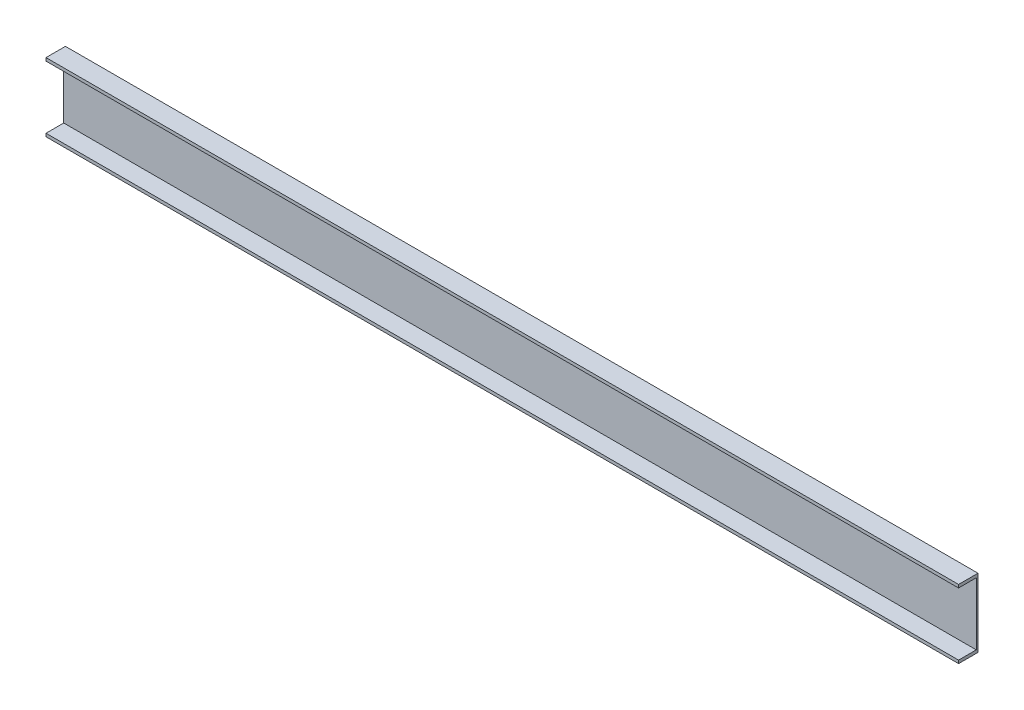
ISO-10303-21;
HEADER;
FILE_DESCRIPTION(('STEP AP214'),'2;1');
FILE_NAME('part.step','',(''),(''),'','','');
FILE_SCHEMA(('AUTOMOTIVE_DESIGN { 1 0 10303 214 1 1 1 1 }'));
ENDSEC;
DATA;
#1=APPLICATION_CONTEXT('core data for automotive mechanical design processes');
#2=APPLICATION_PROTOCOL_DEFINITION('international standard','automotive_design',2000,#1);
#3=PRODUCT_CONTEXT('',#1,'mechanical');
#4=PRODUCT('Part','Part','',(#3));
#5=PRODUCT_RELATED_PRODUCT_CATEGORY('part','',(#4));
#6=PRODUCT_DEFINITION_FORMATION('','',#4);
#7=PRODUCT_DEFINITION_CONTEXT('part definition',#1,'design');
#8=PRODUCT_DEFINITION('design','',#6,#7);
#9=PRODUCT_DEFINITION_SHAPE('','',#8);
#10=(LENGTH_UNIT() NAMED_UNIT(*) SI_UNIT(.MILLI.,.METRE.));
#11=(NAMED_UNIT(*) PLANE_ANGLE_UNIT() SI_UNIT($,.RADIAN.));
#12=(NAMED_UNIT(*) SI_UNIT($,.STERADIAN.) SOLID_ANGLE_UNIT());
#13=UNCERTAINTY_MEASURE_WITH_UNIT(LENGTH_MEASURE(1.E-05),#10,'distance_accuracy_value','');
#14=(GEOMETRIC_REPRESENTATION_CONTEXT(3) GLOBAL_UNCERTAINTY_ASSIGNED_CONTEXT((#13)) GLOBAL_UNIT_ASSIGNED_CONTEXT((#10,
#11,#12)) REPRESENTATION_CONTEXT('',''));
#15=CARTESIAN_POINT('',(0.,0.,0.));
#16=DIRECTION('',(0.,0.,1.));
#17=DIRECTION('',(1.,0.,0.));
#18=AXIS2_PLACEMENT_3D('',#15,#16,#17);
#19=CARTESIAN_POINT('',(-1995.,-150.,7.5));
#20=DIRECTION('',(0.,0.,1.));
#21=DIRECTION('',(1.,0.,0.));
#22=AXIS2_PLACEMENT_3D('',#19,#20,#21);
#23=PLANE('',#22);
#24=DIRECTION('',(0.,-1.,0.));
#25=VECTOR('',#24,1.);
#26=CARTESIAN_POINT('',(-1995.,150.,7.5));
#27=LINE('',#26,#25);
#28=CARTESIAN_POINT('',(-1995.,136.5,7.5));
#29=VERTEX_POINT('',#28);
#30=CARTESIAN_POINT('',(-1995.,-136.5,7.5));
#31=VERTEX_POINT('',#30);
#32=EDGE_CURVE('E55',#29,#31,#27,.T.);
#33=ORIENTED_EDGE('',*,*,#32,.T.);
#34=DIRECTION('',(-1.,0.,0.));
#35=VECTOR('',#34,1.);
#36=CARTESIAN_POINT('',(-1995.,-136.5,7.5));
#37=LINE('',#36,#35);
#38=CARTESIAN_POINT('',(1995.,-136.5,7.5));
#39=VERTEX_POINT('',#38);
#40=EDGE_CURVE('E50',#39,#31,#37,.T.);
#41=ORIENTED_EDGE('',*,*,#40,.F.);
#42=DIRECTION('',(0.,1.,0.));
#43=VECTOR('',#42,1.);
#44=CARTESIAN_POINT('',(1995.,150.,7.5));
#45=LINE('',#44,#43);
#46=CARTESIAN_POINT('',(1995.,136.5,7.5));
#47=VERTEX_POINT('',#46);
#48=EDGE_CURVE('E36',#39,#47,#45,.T.);
#49=ORIENTED_EDGE('',*,*,#48,.T.);
#50=DIRECTION('',(1.,0.,0.));
#51=VECTOR('',#50,1.);
#52=CARTESIAN_POINT('',(-1995.,136.5,7.5));
#53=LINE('',#52,#51);
#54=EDGE_CURVE('E129',#29,#47,#53,.T.);
#55=ORIENTED_EDGE('',*,*,#54,.F.);
#56=EDGE_LOOP('',(#33,#41,#49,#55));
#57=FACE_BOUND('',#56,.T.);
#58=ADVANCED_FACE('F32',(#57),#23,.T.);
#59=CARTESIAN_POINT('',(-1995.,150.,7.5));
#60=DIRECTION('',(1.,0.,0.));
#61=DIRECTION('',(0.,0.,-1.));
#62=AXIS2_PLACEMENT_3D('',#59,#60,#61);
#63=PLANE('',#62);
#64=DIRECTION('',(0.,-1.,0.));
#65=VECTOR('',#64,1.);
#66=CARTESIAN_POINT('',(-1995.,150.,0.));
#67=LINE('',#66,#65);
#68=CARTESIAN_POINT('',(-1995.,150.,0.));
#69=VERTEX_POINT('',#68);
#70=CARTESIAN_POINT('',(-1995.,-150.,0.));
#71=VERTEX_POINT('',#70);
#72=EDGE_CURVE('E155',#69,#71,#67,.T.);
#73=ORIENTED_EDGE('',*,*,#72,.T.);
#74=DIRECTION('',(0.,0.,-1.));
#75=VECTOR('',#74,1.);
#76=CARTESIAN_POINT('',(-1995.,-150.,7.5));
#77=LINE('',#76,#75);
#78=CARTESIAN_POINT('',(-1995.,-150.,85.));
#79=VERTEX_POINT('',#78);
#80=EDGE_CURVE('E11',#79,#71,#77,.T.);
#81=ORIENTED_EDGE('',*,*,#80,.F.);
#82=DIRECTION('',(0.,-1.,0.));
#83=VECTOR('',#82,1.);
#84=CARTESIAN_POINT('',(-1995.,-150.,85.));
#85=LINE('',#84,#83);
#86=CARTESIAN_POINT('',(-1995.,-136.5,85.));
#87=VERTEX_POINT('',#86);
#88=EDGE_CURVE('E119',#87,#79,#85,.T.);
#89=ORIENTED_EDGE('',*,*,#88,.F.);
#90=DIRECTION('',(0.,0.,-1.));
#91=VECTOR('',#90,1.);
#92=CARTESIAN_POINT('',(-1995.,-136.5,85.));
#93=LINE('',#92,#91);
#94=EDGE_CURVE('E124',#87,#31,#93,.T.);
#95=ORIENTED_EDGE('',*,*,#94,.T.);
#96=ORIENTED_EDGE('',*,*,#32,.F.);
#97=DIRECTION('',(0.,0.,-1.));
#98=VECTOR('',#97,1.);
#99=CARTESIAN_POINT('',(-1995.,136.5,85.));
#100=LINE('',#99,#98);
#101=CARTESIAN_POINT('',(-1995.,136.5,85.));
#102=VERTEX_POINT('',#101);
#103=EDGE_CURVE('E151',#102,#29,#100,.T.);
#104=ORIENTED_EDGE('',*,*,#103,.F.);
#105=DIRECTION('',(0.,-1.,0.));
#106=VECTOR('',#105,1.);
#107=CARTESIAN_POINT('',(-1995.,150.,85.));
#108=LINE('',#107,#106);
#109=CARTESIAN_POINT('',(-1995.,150.,85.));
#110=VERTEX_POINT('',#109);
#111=EDGE_CURVE('E130',#110,#102,#108,.T.);
#112=ORIENTED_EDGE('',*,*,#111,.F.);
#113=DIRECTION('',(0.,0.,-1.));
#114=VECTOR('',#113,1.);
#115=CARTESIAN_POINT('',(-1995.,150.,7.5));
#116=LINE('',#115,#114);
#117=EDGE_CURVE('E171',#110,#69,#116,.T.);
#118=ORIENTED_EDGE('',*,*,#117,.T.);
#119=EDGE_LOOP('',(#73,#81,#89,#95,#96,#104,#112,#118));
#120=FACE_BOUND('',#119,.T.);
#121=ADVANCED_FACE('F34',(#120),#63,.F.);
#122=CARTESIAN_POINT('',(-1995.,-150.,7.5));
#123=DIRECTION('',(0.,1.,0.));
#124=DIRECTION('',(-1.,0.,0.));
#125=AXIS2_PLACEMENT_3D('',#122,#123,#124);
#126=PLANE('',#125);
#127=DIRECTION('',(1.,0.,0.));
#128=VECTOR('',#127,1.);
#129=CARTESIAN_POINT('',(-1995.,-150.,0.));
#130=LINE('',#129,#128);
#131=CARTESIAN_POINT('',(1995.,-150.,0.));
#132=VERTEX_POINT('',#131);
#133=EDGE_CURVE('E102',#71,#132,#130,.T.);
#134=ORIENTED_EDGE('',*,*,#133,.T.);
#135=DIRECTION('',(0.,0.,-1.));
#136=VECTOR('',#135,1.);
#137=CARTESIAN_POINT('',(1995.,-150.,7.5));
#138=LINE('',#137,#136);
#139=CARTESIAN_POINT('',(1995.,-150.,85.));
#140=VERTEX_POINT('',#139);
#141=EDGE_CURVE('E42',#140,#132,#138,.T.);
#142=ORIENTED_EDGE('',*,*,#141,.F.);
#143=DIRECTION('',(1.,0.,0.));
#144=VECTOR('',#143,1.);
#145=CARTESIAN_POINT('',(-1995.,-150.,85.));
#146=LINE('',#145,#144);
#147=EDGE_CURVE('E101',#79,#140,#146,.T.);
#148=ORIENTED_EDGE('',*,*,#147,.F.);
#149=ORIENTED_EDGE('',*,*,#80,.T.);
#150=EDGE_LOOP('',(#134,#142,#148,#149));
#151=FACE_BOUND('',#150,.T.);
#152=ADVANCED_FACE('F99',(#151),#126,.F.);
#153=CARTESIAN_POINT('',(1995.,150.,7.5));
#154=DIRECTION('',(-1.,0.,0.));
#155=DIRECTION('',(0.,0.,1.));
#156=AXIS2_PLACEMENT_3D('',#153,#154,#155);
#157=PLANE('',#156);
#158=DIRECTION('',(0.,1.,0.));
#159=VECTOR('',#158,1.);
#160=CARTESIAN_POINT('',(1995.,150.,0.));
#161=LINE('',#160,#159);
#162=CARTESIAN_POINT('',(1995.,150.,0.));
#163=VERTEX_POINT('',#162);
#164=EDGE_CURVE('E164',#132,#163,#161,.T.);
#165=ORIENTED_EDGE('',*,*,#164,.T.);
#166=DIRECTION('',(0.,0.,-1.));
#167=VECTOR('',#166,1.);
#168=CARTESIAN_POINT('',(1995.,150.,7.5));
#169=LINE('',#168,#167);
#170=CARTESIAN_POINT('',(1995.,150.,85.));
#171=VERTEX_POINT('',#170);
#172=EDGE_CURVE('E105',#171,#163,#169,.T.);
#173=ORIENTED_EDGE('',*,*,#172,.F.);
#174=DIRECTION('',(0.,1.,0.));
#175=VECTOR('',#174,1.);
#176=CARTESIAN_POINT('',(1995.,150.,85.));
#177=LINE('',#176,#175);
#178=CARTESIAN_POINT('',(1995.,136.5,85.));
#179=VERTEX_POINT('',#178);
#180=EDGE_CURVE('E135',#179,#171,#177,.T.);
#181=ORIENTED_EDGE('',*,*,#180,.F.);
#182=DIRECTION('',(0.,0.,-1.));
#183=VECTOR('',#182,1.);
#184=CARTESIAN_POINT('',(1995.,136.5,85.));
#185=LINE('',#184,#183);
#186=EDGE_CURVE('E141',#179,#47,#185,.T.);
#187=ORIENTED_EDGE('',*,*,#186,.T.);
#188=ORIENTED_EDGE('',*,*,#48,.F.);
#189=DIRECTION('',(0.,0.,-1.));
#190=VECTOR('',#189,1.);
#191=CARTESIAN_POINT('',(1995.,-136.5,85.));
#192=LINE('',#191,#190);
#193=CARTESIAN_POINT('',(1995.,-136.5,85.));
#194=VERTEX_POINT('',#193);
#195=EDGE_CURVE('E111',#194,#39,#192,.T.);
#196=ORIENTED_EDGE('',*,*,#195,.F.);
#197=DIRECTION('',(0.,1.,0.));
#198=VECTOR('',#197,1.);
#199=CARTESIAN_POINT('',(1995.,-150.,85.));
#200=LINE('',#199,#198);
#201=EDGE_CURVE('E108',#140,#194,#200,.T.);
#202=ORIENTED_EDGE('',*,*,#201,.F.);
#203=ORIENTED_EDGE('',*,*,#141,.T.);
#204=EDGE_LOOP('',(#165,#173,#181,#187,#188,#196,#202,#203));
#205=FACE_BOUND('',#204,.T.);
#206=ADVANCED_FACE('F109',(#205),#157,.F.);
#207=CARTESIAN_POINT('',(-1995.,150.,7.5));
#208=DIRECTION('',(0.,-1.,0.));
#209=DIRECTION('',(1.,0.,0.));
#210=AXIS2_PLACEMENT_3D('',#207,#208,#209);
#211=PLANE('',#210);
#212=DIRECTION('',(-1.,0.,0.));
#213=VECTOR('',#212,1.);
#214=CARTESIAN_POINT('',(-1995.,150.,0.));
#215=LINE('',#214,#213);
#216=EDGE_CURVE('E169',#163,#69,#215,.T.);
#217=ORIENTED_EDGE('',*,*,#216,.T.);
#218=ORIENTED_EDGE('',*,*,#117,.F.);
#219=DIRECTION('',(-1.,0.,0.));
#220=VECTOR('',#219,1.);
#221=CARTESIAN_POINT('',(-1995.,150.,85.));
#222=LINE('',#221,#220);
#223=EDGE_CURVE('E138',#171,#110,#222,.T.);
#224=ORIENTED_EDGE('',*,*,#223,.F.);
#225=ORIENTED_EDGE('',*,*,#172,.T.);
#226=EDGE_LOOP('',(#217,#218,#224,#225));
#227=FACE_BOUND('',#226,.T.);
#228=ADVANCED_FACE('F177',(#227),#211,.F.);
#229=CARTESIAN_POINT('',(-1995.,-150.,0.));
#230=DIRECTION('',(0.,0.,1.));
#231=DIRECTION('',(1.,0.,0.));
#232=AXIS2_PLACEMENT_3D('',#229,#230,#231);
#233=PLANE('',#232);
#234=ORIENTED_EDGE('',*,*,#72,.F.);
#235=ORIENTED_EDGE('',*,*,#216,.F.);
#236=ORIENTED_EDGE('',*,*,#164,.F.);
#237=ORIENTED_EDGE('',*,*,#133,.F.);
#238=EDGE_LOOP('',(#234,#235,#236,#237));
#239=FACE_BOUND('',#238,.T.);
#240=ADVANCED_FACE('F180',(#239),#233,.F.);
#241=CARTESIAN_POINT('',(-1995.,136.5,85.));
#242=DIRECTION('',(0.,1.,0.));
#243=DIRECTION('',(0.,0.,1.));
#244=AXIS2_PLACEMENT_3D('',#241,#242,#243);
#245=PLANE('',#244);
#246=ORIENTED_EDGE('',*,*,#54,.T.);
#247=ORIENTED_EDGE('',*,*,#186,.F.);
#248=DIRECTION('',(1.,0.,0.));
#249=VECTOR('',#248,1.);
#250=CARTESIAN_POINT('',(-1995.,136.5,85.));
#251=LINE('',#250,#249);
#252=EDGE_CURVE('E133',#102,#179,#251,.T.);
#253=ORIENTED_EDGE('',*,*,#252,.F.);
#254=ORIENTED_EDGE('',*,*,#103,.T.);
#255=EDGE_LOOP('',(#246,#247,#253,#254));
#256=FACE_BOUND('',#255,.T.);
#257=ADVANCED_FACE('F192',(#256),#245,.F.);
#258=CARTESIAN_POINT('',(-1995.,136.5,85.));
#259=DIRECTION('',(0.,0.,1.));
#260=DIRECTION('',(1.,0.,0.));
#261=AXIS2_PLACEMENT_3D('',#258,#259,#260);
#262=PLANE('',#261);
#263=ORIENTED_EDGE('',*,*,#111,.T.);
#264=ORIENTED_EDGE('',*,*,#252,.T.);
#265=ORIENTED_EDGE('',*,*,#180,.T.);
#266=ORIENTED_EDGE('',*,*,#223,.T.);
#267=EDGE_LOOP('',(#263,#264,#265,#266));
#268=FACE_BOUND('',#267,.T.);
#269=ADVANCED_FACE('F185',(#268),#262,.T.);
#270=CARTESIAN_POINT('',(-1995.,-136.5,85.));
#271=DIRECTION('',(0.,-1.,0.));
#272=DIRECTION('',(0.,0.,-1.));
#273=AXIS2_PLACEMENT_3D('',#270,#271,#272);
#274=PLANE('',#273);
#275=ORIENTED_EDGE('',*,*,#40,.T.);
#276=ORIENTED_EDGE('',*,*,#94,.F.);
#277=DIRECTION('',(-1.,0.,0.));
#278=VECTOR('',#277,1.);
#279=CARTESIAN_POINT('',(-1995.,-136.5,85.));
#280=LINE('',#279,#278);
#281=EDGE_CURVE('E114',#194,#87,#280,.T.);
#282=ORIENTED_EDGE('',*,*,#281,.F.);
#283=ORIENTED_EDGE('',*,*,#195,.T.);
#284=EDGE_LOOP('',(#275,#276,#282,#283));
#285=FACE_BOUND('',#284,.T.);
#286=ADVANCED_FACE('F183',(#285),#274,.F.);
#287=CARTESIAN_POINT('',(1995.,-150.,85.));
#288=DIRECTION('',(0.,0.,1.));
#289=DIRECTION('',(1.,0.,0.));
#290=AXIS2_PLACEMENT_3D('',#287,#288,#289);
#291=PLANE('',#290);
#292=ORIENTED_EDGE('',*,*,#147,.T.);
#293=ORIENTED_EDGE('',*,*,#201,.T.);
#294=ORIENTED_EDGE('',*,*,#281,.T.);
#295=ORIENTED_EDGE('',*,*,#88,.T.);
#296=EDGE_LOOP('',(#292,#293,#294,#295));
#297=FACE_BOUND('',#296,.T.);
#298=ADVANCED_FACE('F117',(#297),#291,.T.);
#299=CLOSED_SHELL('',(#58,#121,#152,#206,#228,#240,#257,#269,#286,#298));
#300=MANIFOLD_SOLID_BREP('B2',#299);
#301=ADVANCED_BREP_SHAPE_REPRESENTATION('',(#18,#300),#14);
#302=SHAPE_DEFINITION_REPRESENTATION(#9,#301);
ENDSEC;
END-ISO-10303-21;
